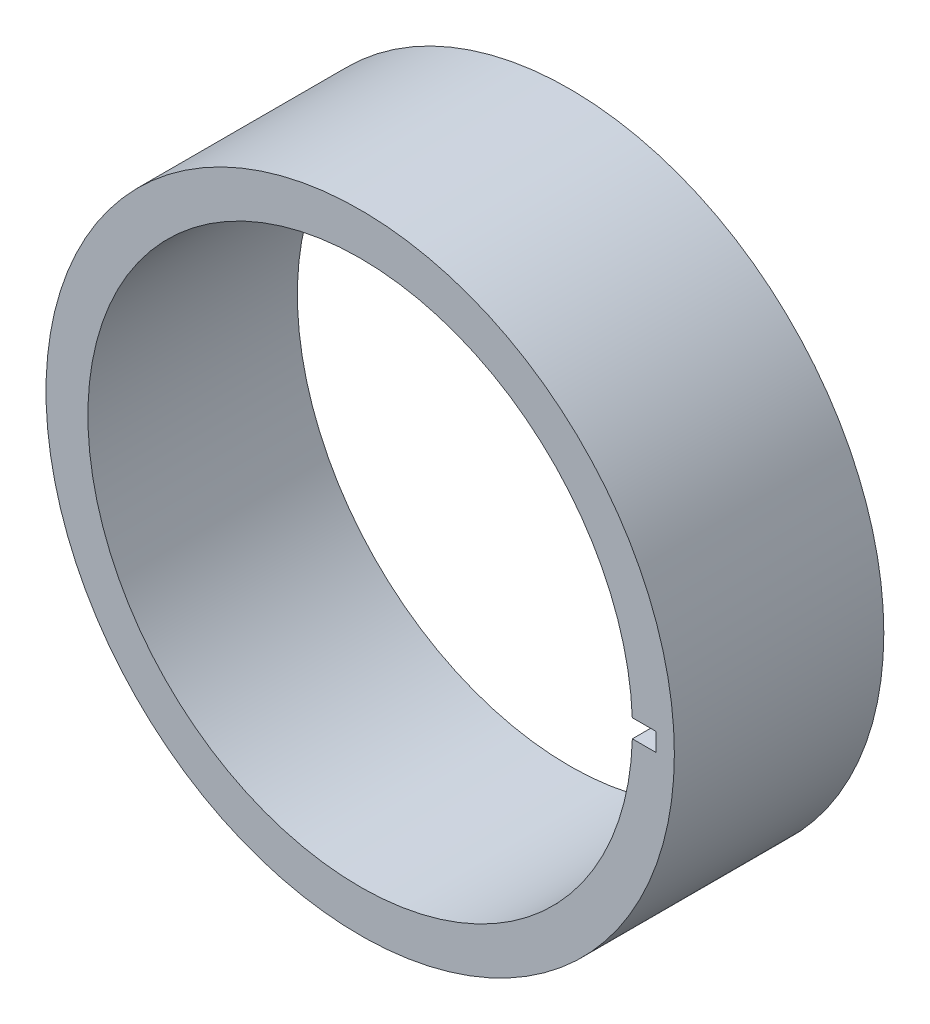
ISO-10303-21;
HEADER;
FILE_DESCRIPTION(('STEP AP214'),'2;1');
FILE_NAME('part.step','',(''),(''),'','','');
FILE_SCHEMA(('AUTOMOTIVE_DESIGN { 1 0 10303 214 1 1 1 1 }'));
ENDSEC;
DATA;
#1=APPLICATION_CONTEXT('core data for automotive mechanical design processes');
#2=APPLICATION_PROTOCOL_DEFINITION('international standard','automotive_design',2000,#1);
#3=PRODUCT_CONTEXT('',#1,'mechanical');
#4=PRODUCT('Part','Part','',(#3));
#5=PRODUCT_RELATED_PRODUCT_CATEGORY('part','',(#4));
#6=PRODUCT_DEFINITION_FORMATION('','',#4);
#7=PRODUCT_DEFINITION_CONTEXT('part definition',#1,'design');
#8=PRODUCT_DEFINITION('design','',#6,#7);
#9=PRODUCT_DEFINITION_SHAPE('','',#8);
#10=(LENGTH_UNIT() NAMED_UNIT(*) SI_UNIT(.MILLI.,.METRE.));
#11=(NAMED_UNIT(*) PLANE_ANGLE_UNIT() SI_UNIT($,.RADIAN.));
#12=(NAMED_UNIT(*) SI_UNIT($,.STERADIAN.) SOLID_ANGLE_UNIT());
#13=UNCERTAINTY_MEASURE_WITH_UNIT(LENGTH_MEASURE(1.E-05),#10,'distance_accuracy_value','');
#14=(GEOMETRIC_REPRESENTATION_CONTEXT(3) GLOBAL_UNCERTAINTY_ASSIGNED_CONTEXT((#13)) GLOBAL_UNIT_ASSIGNED_CONTEXT((#10,
#11,#12)) REPRESENTATION_CONTEXT('',''));
#15=CARTESIAN_POINT('',(0.,0.,0.));
#16=DIRECTION('',(0.,0.,1.));
#17=DIRECTION('',(1.,0.,0.));
#18=AXIS2_PLACEMENT_3D('',#15,#16,#17);
#19=CARTESIAN_POINT('',(0.,0.,-20.));
#20=DIRECTION('',(0.,0.,1.));
#21=DIRECTION('',(1.,0.,0.));
#22=AXIS2_PLACEMENT_3D('',#19,#20,#21);
#23=CYLINDRICAL_SURFACE('',#22,60.);
#24=CARTESIAN_POINT('',(0.,0.,-20.));
#25=DIRECTION('',(0.,0.,1.));
#26=DIRECTION('',(1.,0.,0.));
#27=AXIS2_PLACEMENT_3D('',#24,#25,#26);
#28=CIRCLE('',#27,60.);
#29=CARTESIAN_POINT('',(60.,0.,-20.));
#30=VERTEX_POINT('',#29);
#31=EDGE_CURVE('E11',#30,#30,#28,.T.);
#32=ORIENTED_EDGE('',*,*,#31,.T.);
#33=EDGE_LOOP('',(#32));
#34=FACE_BOUND('',#33,.T.);
#35=CARTESIAN_POINT('',(0.,0.,20.));
#36=DIRECTION('',(0.,0.,1.));
#37=DIRECTION('',(1.,0.,0.));
#38=AXIS2_PLACEMENT_3D('',#35,#36,#37);
#39=CIRCLE('',#38,60.);
#40=CARTESIAN_POINT('',(60.,0.,20.));
#41=VERTEX_POINT('',#40);
#42=EDGE_CURVE('E99',#41,#41,#39,.T.);
#43=ORIENTED_EDGE('',*,*,#42,.F.);
#44=EDGE_LOOP('',(#43));
#45=FACE_BOUND('',#44,.T.);
#46=ADVANCED_FACE('F39',(#34,#45),#23,.T.);
#47=CARTESIAN_POINT('',(0.,0.,-20.));
#48=DIRECTION('',(0.,0.,1.));
#49=DIRECTION('',(1.,0.,0.));
#50=AXIS2_PLACEMENT_3D('',#47,#48,#49);
#51=PLANE('',#50);
#52=DIRECTION('',(0.,1.,0.));
#53=VECTOR('',#52,1.);
#54=CARTESIAN_POINT('',(56.4655817265789,-1.51240537464179,-20.));
#55=LINE('',#54,#53);
#56=CARTESIAN_POINT('',(56.4655817265789,-1.51240537464179,-20.));
#57=VERTEX_POINT('',#56);
#58=CARTESIAN_POINT('',(56.4655817265789,1.97182156369131,-20.));
#59=VERTEX_POINT('',#58);
#60=EDGE_CURVE('E115',#57,#59,#55,.T.);
#61=ORIENTED_EDGE('',*,*,#60,.T.);
#62=DIRECTION('',(-1.,0.,0.));
#63=VECTOR('',#62,1.);
#64=CARTESIAN_POINT('',(56.4655817265789,1.97182156369131,-20.));
#65=LINE('',#64,#63);
#66=CARTESIAN_POINT('',(51.9626011639233,1.97182156369131,-20.));
#67=VERTEX_POINT('',#66);
#68=EDGE_CURVE('E87',#59,#67,#65,.T.);
#69=ORIENTED_EDGE('',*,*,#68,.T.);
#70=CARTESIAN_POINT('',(0.,0.,-20.));
#71=DIRECTION('',(0.,0.,1.));
#72=DIRECTION('',(1.,0.,0.));
#73=AXIS2_PLACEMENT_3D('',#70,#71,#72);
#74=CIRCLE('',#73,52.);
#75=CARTESIAN_POINT('',(51.9780014042744,-1.51240537464179,-20.));
#76=VERTEX_POINT('',#75);
#77=EDGE_CURVE('E46',#67,#76,#74,.T.);
#78=ORIENTED_EDGE('',*,*,#77,.T.);
#79=DIRECTION('',(1.,0.,0.));
#80=VECTOR('',#79,1.);
#81=CARTESIAN_POINT('',(51.9780014042744,-1.51240537464179,-20.));
#82=LINE('',#81,#80);
#83=EDGE_CURVE('E81',#76,#57,#82,.T.);
#84=ORIENTED_EDGE('',*,*,#83,.T.);
#85=EDGE_LOOP('',(#61,#69,#78,#84));
#86=FACE_BOUND('',#85,.T.);
#87=ORIENTED_EDGE('',*,*,#31,.F.);
#88=EDGE_LOOP('',(#87));
#89=FACE_BOUND('',#88,.T.);
#90=ADVANCED_FACE('F108',(#86,#89),#51,.F.);
#91=CARTESIAN_POINT('',(0.,0.,-20.));
#92=DIRECTION('',(0.,0.,1.));
#93=DIRECTION('',(1.,0.,0.));
#94=AXIS2_PLACEMENT_3D('',#91,#92,#93);
#95=CYLINDRICAL_SURFACE('',#94,52.);
#96=ORIENTED_EDGE('',*,*,#77,.F.);
#97=DIRECTION('',(0.,0.,1.));
#98=VECTOR('',#97,1.);
#99=CARTESIAN_POINT('',(51.9626011639233,1.97182156369131,-20.));
#100=LINE('',#99,#98);
#101=CARTESIAN_POINT('',(51.9626011639233,1.97182156369131,20.));
#102=VERTEX_POINT('',#101);
#103=EDGE_CURVE('E63',#67,#102,#100,.T.);
#104=ORIENTED_EDGE('',*,*,#103,.T.);
#105=CARTESIAN_POINT('',(0.,0.,20.));
#106=DIRECTION('',(0.,0.,1.));
#107=DIRECTION('',(1.,0.,0.));
#108=AXIS2_PLACEMENT_3D('',#105,#106,#107);
#109=CIRCLE('',#108,52.);
#110=CARTESIAN_POINT('',(51.9780014042744,-1.51240537464179,20.));
#111=VERTEX_POINT('',#110);
#112=EDGE_CURVE('E92',#102,#111,#109,.T.);
#113=ORIENTED_EDGE('',*,*,#112,.T.);
#114=DIRECTION('',(0.,0.,1.));
#115=VECTOR('',#114,1.);
#116=CARTESIAN_POINT('',(51.9780014042744,-1.51240537464179,-20.));
#117=LINE('',#116,#115);
#118=EDGE_CURVE('E77',#76,#111,#117,.T.);
#119=ORIENTED_EDGE('',*,*,#118,.F.);
#120=EDGE_LOOP('',(#96,#104,#113,#119));
#121=FACE_BOUND('',#120,.T.);
#122=ADVANCED_FACE('F97',(#121),#95,.F.);
#123=CARTESIAN_POINT('',(0.,0.,20.));
#124=DIRECTION('',(0.,0.,1.));
#125=DIRECTION('',(1.,0.,0.));
#126=AXIS2_PLACEMENT_3D('',#123,#124,#125);
#127=PLANE('',#126);
#128=DIRECTION('',(1.,0.,0.));
#129=VECTOR('',#128,1.);
#130=CARTESIAN_POINT('',(51.9780014042744,-1.51240537464179,20.));
#131=LINE('',#130,#129);
#132=CARTESIAN_POINT('',(56.4655817265789,-1.51240537464179,20.));
#133=VERTEX_POINT('',#132);
#134=EDGE_CURVE('E52',#111,#133,#131,.T.);
#135=ORIENTED_EDGE('',*,*,#134,.F.);
#136=ORIENTED_EDGE('',*,*,#112,.F.);
#137=DIRECTION('',(-1.,0.,0.));
#138=VECTOR('',#137,1.);
#139=CARTESIAN_POINT('',(56.4655817265789,1.97182156369131,20.));
#140=LINE('',#139,#138);
#141=CARTESIAN_POINT('',(56.4655817265789,1.97182156369131,20.));
#142=VERTEX_POINT('',#141);
#143=EDGE_CURVE('E116',#142,#102,#140,.T.);
#144=ORIENTED_EDGE('',*,*,#143,.F.);
#145=DIRECTION('',(0.,1.,0.));
#146=VECTOR('',#145,1.);
#147=CARTESIAN_POINT('',(56.4655817265789,-1.51240537464179,20.));
#148=LINE('',#147,#146);
#149=EDGE_CURVE('E100',#133,#142,#148,.T.);
#150=ORIENTED_EDGE('',*,*,#149,.F.);
#151=EDGE_LOOP('',(#135,#136,#144,#150));
#152=FACE_BOUND('',#151,.T.);
#153=ORIENTED_EDGE('',*,*,#42,.T.);
#154=EDGE_LOOP('',(#153));
#155=FACE_BOUND('',#154,.T.);
#156=ADVANCED_FACE('F95',(#152,#155),#127,.T.);
#157=CARTESIAN_POINT('',(56.4655817265789,1.97182156369131,-20.));
#158=DIRECTION('',(0.,1.,0.));
#159=DIRECTION('',(0.,0.,1.));
#160=AXIS2_PLACEMENT_3D('',#157,#158,#159);
#161=PLANE('',#160);
#162=ORIENTED_EDGE('',*,*,#103,.F.);
#163=ORIENTED_EDGE('',*,*,#68,.F.);
#164=DIRECTION('',(0.,0.,1.));
#165=VECTOR('',#164,1.);
#166=CARTESIAN_POINT('',(56.4655817265789,1.97182156369131,-20.));
#167=LINE('',#166,#165);
#168=EDGE_CURVE('E102',#59,#142,#167,.T.);
#169=ORIENTED_EDGE('',*,*,#168,.T.);
#170=ORIENTED_EDGE('',*,*,#143,.T.);
#171=EDGE_LOOP('',(#162,#163,#169,#170));
#172=FACE_BOUND('',#171,.T.);
#173=ADVANCED_FACE('F120',(#172),#161,.F.);
#174=CARTESIAN_POINT('',(56.4655817265789,-1.51240537464179,-20.));
#175=DIRECTION('',(1.,0.,0.));
#176=DIRECTION('',(0.,0.,-1.));
#177=AXIS2_PLACEMENT_3D('',#174,#175,#176);
#178=PLANE('',#177);
#179=ORIENTED_EDGE('',*,*,#168,.F.);
#180=ORIENTED_EDGE('',*,*,#60,.F.);
#181=DIRECTION('',(0.,0.,1.));
#182=VECTOR('',#181,1.);
#183=CARTESIAN_POINT('',(56.4655817265789,-1.51240537464179,-20.));
#184=LINE('',#183,#182);
#185=EDGE_CURVE('E88',#57,#133,#184,.T.);
#186=ORIENTED_EDGE('',*,*,#185,.T.);
#187=ORIENTED_EDGE('',*,*,#149,.T.);
#188=EDGE_LOOP('',(#179,#180,#186,#187));
#189=FACE_BOUND('',#188,.T.);
#190=ADVANCED_FACE('F117',(#189),#178,.F.);
#191=CARTESIAN_POINT('',(51.9780014042744,-1.51240537464179,-20.));
#192=DIRECTION('',(0.,-1.,0.));
#193=DIRECTION('',(0.,0.,-1.));
#194=AXIS2_PLACEMENT_3D('',#191,#192,#193);
#195=PLANE('',#194);
#196=ORIENTED_EDGE('',*,*,#185,.F.);
#197=ORIENTED_EDGE('',*,*,#83,.F.);
#198=ORIENTED_EDGE('',*,*,#118,.T.);
#199=ORIENTED_EDGE('',*,*,#134,.T.);
#200=EDGE_LOOP('',(#196,#197,#198,#199));
#201=FACE_BOUND('',#200,.T.);
#202=ADVANCED_FACE('F80',(#201),#195,.F.);
#203=CLOSED_SHELL('',(#46,#90,#122,#156,#173,#190,#202));
#204=MANIFOLD_SOLID_BREP('B2',#203);
#205=ADVANCED_BREP_SHAPE_REPRESENTATION('',(#18,#204),#14);
#206=SHAPE_DEFINITION_REPRESENTATION(#9,#205);
ENDSEC;
END-ISO-10303-21;
